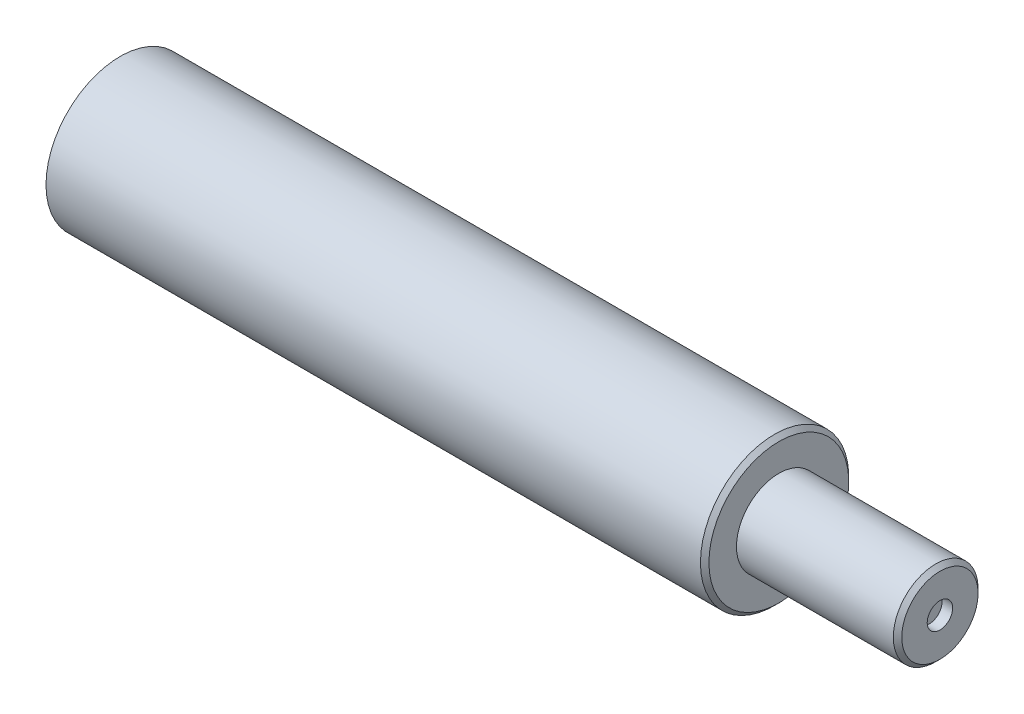
ISO-10303-21;
HEADER;
FILE_DESCRIPTION(('STEP AP214'),'2;1');
FILE_NAME('part.step','',(''),(''),'','','');
FILE_SCHEMA(('AUTOMOTIVE_DESIGN { 1 0 10303 214 1 1 1 1 }'));
ENDSEC;
DATA;
#1=APPLICATION_CONTEXT('core data for automotive mechanical design processes');
#2=APPLICATION_PROTOCOL_DEFINITION('international standard','automotive_design',2000,#1);
#3=PRODUCT_CONTEXT('',#1,'mechanical');
#4=PRODUCT('Part','Part','',(#3));
#5=PRODUCT_RELATED_PRODUCT_CATEGORY('part','',(#4));
#6=PRODUCT_DEFINITION_FORMATION('','',#4);
#7=PRODUCT_DEFINITION_CONTEXT('part definition',#1,'design');
#8=PRODUCT_DEFINITION('design','',#6,#7);
#9=PRODUCT_DEFINITION_SHAPE('','',#8);
#10=(LENGTH_UNIT() NAMED_UNIT(*) SI_UNIT(.MILLI.,.METRE.));
#11=(NAMED_UNIT(*) PLANE_ANGLE_UNIT() SI_UNIT($,.RADIAN.));
#12=(NAMED_UNIT(*) SI_UNIT($,.STERADIAN.) SOLID_ANGLE_UNIT());
#13=UNCERTAINTY_MEASURE_WITH_UNIT(LENGTH_MEASURE(1.E-05),#10,'distance_accuracy_value','');
#14=(GEOMETRIC_REPRESENTATION_CONTEXT(3) GLOBAL_UNCERTAINTY_ASSIGNED_CONTEXT((#13)) GLOBAL_UNIT_ASSIGNED_CONTEXT((#10,
#11,#12)) REPRESENTATION_CONTEXT('',''));
#15=CARTESIAN_POINT('',(0.,0.,0.));
#16=DIRECTION('',(0.,0.,1.));
#17=DIRECTION('',(1.,0.,0.));
#18=AXIS2_PLACEMENT_3D('',#15,#16,#17);
#19=CARTESIAN_POINT('',(0.,17.5,0.));
#20=DIRECTION('',(1.,0.,0.));
#21=DIRECTION('',(0.,0.,-1.));
#22=AXIS2_PLACEMENT_3D('',#19,#20,#21);
#23=PLANE('',#22);
#24=CARTESIAN_POINT('',(0.,-7.,-7.));
#25=DIRECTION('',(-1.,0.,0.));
#26=DIRECTION('',(0.,0.,-1.));
#27=AXIS2_PLACEMENT_3D('',#24,#25,#26);
#28=CIRCLE('',#27,2.5);
#29=CARTESIAN_POINT('',(0.,-7.,-9.5));
#30=VERTEX_POINT('',#29);
#31=EDGE_CURVE('E99',#30,#30,#28,.T.);
#32=ORIENTED_EDGE('',*,*,#31,.F.);
#33=EDGE_LOOP('',(#32));
#34=FACE_BOUND('',#33,.T.);
#35=CARTESIAN_POINT('',(0.,-7.,7.));
#36=DIRECTION('',(-1.,0.,0.));
#37=DIRECTION('',(0.,0.,1.));
#38=AXIS2_PLACEMENT_3D('',#35,#36,#37);
#39=CIRCLE('',#38,2.5);
#40=CARTESIAN_POINT('',(0.,-7.,9.5));
#41=VERTEX_POINT('',#40);
#42=EDGE_CURVE('E107',#41,#41,#39,.T.);
#43=ORIENTED_EDGE('',*,*,#42,.F.);
#44=EDGE_LOOP('',(#43));
#45=FACE_BOUND('',#44,.T.);
#46=CARTESIAN_POINT('',(0.,7.,7.));
#47=DIRECTION('',(-1.,0.,0.));
#48=DIRECTION('',(0.,0.,-1.));
#49=AXIS2_PLACEMENT_3D('',#46,#47,#48);
#50=CIRCLE('',#49,2.5);
#51=CARTESIAN_POINT('',(0.,7.,4.5));
#52=VERTEX_POINT('',#51);
#53=EDGE_CURVE('E115',#52,#52,#50,.T.);
#54=ORIENTED_EDGE('',*,*,#53,.F.);
#55=EDGE_LOOP('',(#54));
#56=FACE_BOUND('',#55,.T.);
#57=CARTESIAN_POINT('',(0.,7.,-7.));
#58=DIRECTION('',(-1.,0.,0.));
#59=DIRECTION('',(0.,0.,1.));
#60=AXIS2_PLACEMENT_3D('',#57,#58,#59);
#61=CIRCLE('',#60,2.5);
#62=CARTESIAN_POINT('',(0.,7.,-4.5));
#63=VERTEX_POINT('',#62);
#64=EDGE_CURVE('E91',#63,#63,#61,.T.);
#65=ORIENTED_EDGE('',*,*,#64,.F.);
#66=EDGE_LOOP('',(#65));
#67=FACE_BOUND('',#66,.T.);
#68=CARTESIAN_POINT('',(0.,0.,0.));
#69=DIRECTION('',(-1.,0.,0.));
#70=DIRECTION('',(0.,0.,1.));
#71=AXIS2_PLACEMENT_3D('',#68,#69,#70);
#72=CIRCLE('',#71,17.5);
#73=CARTESIAN_POINT('',(0.,0.,17.5));
#74=VERTEX_POINT('',#73);
#75=EDGE_CURVE('E74',#74,#74,#72,.T.);
#76=ORIENTED_EDGE('',*,*,#75,.T.);
#77=EDGE_LOOP('',(#76));
#78=FACE_BOUND('',#77,.T.);
#79=ADVANCED_FACE('F49',(#34,#45,#56,#67,#78),#23,.F.);
#80=CARTESIAN_POINT('',(0.,0.,0.));
#81=DIRECTION('',(-1.,0.,0.));
#82=DIRECTION('',(0.,0.,1.));
#83=AXIS2_PLACEMENT_3D('',#80,#81,#82);
#84=CYLINDRICAL_SURFACE('',#83,17.5);
#85=CARTESIAN_POINT('',(154.4,0.,0.));
#86=DIRECTION('',(-1.,0.,0.));
#87=DIRECTION('',(0.,0.,1.));
#88=AXIS2_PLACEMENT_3D('',#85,#86,#87);
#89=CIRCLE('',#88,17.5);
#90=CARTESIAN_POINT('',(154.4,0.,17.5));
#91=VERTEX_POINT('',#90);
#92=EDGE_CURVE('E58',#91,#91,#89,.T.);
#93=ORIENTED_EDGE('',*,*,#92,.T.);
#94=EDGE_LOOP('',(#93));
#95=FACE_BOUND('',#94,.T.);
#96=ORIENTED_EDGE('',*,*,#75,.F.);
#97=EDGE_LOOP('',(#96));
#98=FACE_BOUND('',#97,.T.);
#99=ADVANCED_FACE('F134',(#95,#98),#84,.T.);
#100=CARTESIAN_POINT('',(155.4,17.5,0.));
#101=DIRECTION('',(-1.,0.,0.));
#102=DIRECTION('',(0.,0.,1.));
#103=AXIS2_PLACEMENT_3D('',#100,#101,#102);
#104=PLANE('',#103);
#105=CARTESIAN_POINT('',(155.4,0.,0.));
#106=DIRECTION('',(-1.,0.,0.));
#107=DIRECTION('',(0.,0.,1.));
#108=AXIS2_PLACEMENT_3D('',#105,#106,#107);
#109=CIRCLE('',#108,16.4999999999999);
#110=CARTESIAN_POINT('',(155.4,0.,16.4999999999999));
#111=VERTEX_POINT('',#110);
#112=EDGE_CURVE('E10',#111,#111,#109,.F.);
#113=ORIENTED_EDGE('',*,*,#112,.T.);
#114=EDGE_LOOP('',(#113));
#115=FACE_BOUND('',#114,.T.);
#116=CARTESIAN_POINT('',(155.4,0.,0.));
#117=DIRECTION('',(-1.,0.,0.));
#118=DIRECTION('',(0.,0.,1.));
#119=AXIS2_PLACEMENT_3D('',#116,#117,#118);
#120=CIRCLE('',#119,10.);
#121=CARTESIAN_POINT('',(155.4,0.,10.));
#122=VERTEX_POINT('',#121);
#123=EDGE_CURVE('E78',#122,#122,#120,.T.);
#124=ORIENTED_EDGE('',*,*,#123,.T.);
#125=EDGE_LOOP('',(#124));
#126=FACE_BOUND('',#125,.T.);
#127=ADVANCED_FACE('F142',(#115,#126),#104,.F.);
#128=CARTESIAN_POINT('',(0.,0.,0.));
#129=DIRECTION('',(-1.,0.,0.));
#130=DIRECTION('',(0.,0.,1.));
#131=AXIS2_PLACEMENT_3D('',#128,#129,#130);
#132=CYLINDRICAL_SURFACE('',#131,10.);
#133=CARTESIAN_POINT('',(192.4,0.,0.));
#134=DIRECTION('',(-1.,0.,0.));
#135=DIRECTION('',(0.,0.,1.));
#136=AXIS2_PLACEMENT_3D('',#133,#134,#135);
#137=CIRCLE('',#136,10.);
#138=CARTESIAN_POINT('',(192.4,0.,10.));
#139=VERTEX_POINT('',#138);
#140=EDGE_CURVE('E68',#139,#139,#137,.T.);
#141=ORIENTED_EDGE('',*,*,#140,.T.);
#142=EDGE_LOOP('',(#141));
#143=FACE_BOUND('',#142,.T.);
#144=ORIENTED_EDGE('',*,*,#123,.F.);
#145=EDGE_LOOP('',(#144));
#146=FACE_BOUND('',#145,.T.);
#147=ADVANCED_FACE('F147',(#143,#146),#132,.T.);
#148=CARTESIAN_POINT('',(193.4,10.,0.));
#149=DIRECTION('',(-1.,0.,0.));
#150=DIRECTION('',(0.,0.,1.));
#151=AXIS2_PLACEMENT_3D('',#148,#149,#150);
#152=PLANE('',#151);
#153=CARTESIAN_POINT('',(193.4,0.,0.));
#154=DIRECTION('',(-1.,0.,0.));
#155=DIRECTION('',(0.,0.,1.));
#156=AXIS2_PLACEMENT_3D('',#153,#154,#155);
#157=CIRCLE('',#156,9.00000000000004);
#158=CARTESIAN_POINT('',(193.4,0.,9.00000000000004));
#159=VERTEX_POINT('',#158);
#160=EDGE_CURVE('E63',#159,#159,#157,.F.);
#161=ORIENTED_EDGE('',*,*,#160,.T.);
#162=EDGE_LOOP('',(#161));
#163=FACE_BOUND('',#162,.T.);
#164=CARTESIAN_POINT('',(193.4,0.,0.));
#165=DIRECTION('',(-1.,0.,0.));
#166=DIRECTION('',(0.,0.,1.));
#167=AXIS2_PLACEMENT_3D('',#164,#165,#166);
#168=CIRCLE('',#167,3.);
#169=CARTESIAN_POINT('',(193.4,0.,3.));
#170=VERTEX_POINT('',#169);
#171=EDGE_CURVE('E82',#170,#170,#168,.T.);
#172=ORIENTED_EDGE('',*,*,#171,.T.);
#173=EDGE_LOOP('',(#172));
#174=FACE_BOUND('',#173,.T.);
#175=ADVANCED_FACE('F172',(#163,#174),#152,.F.);
#176=CARTESIAN_POINT('',(0.,0.,0.));
#177=DIRECTION('',(-1.,0.,0.));
#178=DIRECTION('',(0.,0.,1.));
#179=AXIS2_PLACEMENT_3D('',#176,#177,#178);
#180=CYLINDRICAL_SURFACE('',#179,3.);
#181=ORIENTED_EDGE('',*,*,#171,.F.);
#182=EDGE_LOOP('',(#181));
#183=FACE_BOUND('',#182,.T.);
#184=CARTESIAN_POINT('',(190.9,0.,0.));
#185=DIRECTION('',(-1.,0.,0.));
#186=DIRECTION('',(0.,0.,1.));
#187=AXIS2_PLACEMENT_3D('',#184,#185,#186);
#188=CIRCLE('',#187,3.);
#189=CARTESIAN_POINT('',(190.9,0.,3.));
#190=VERTEX_POINT('',#189);
#191=EDGE_CURVE('E86',#190,#190,#188,.T.);
#192=ORIENTED_EDGE('',*,*,#191,.T.);
#193=EDGE_LOOP('',(#192));
#194=FACE_BOUND('',#193,.T.);
#195=ADVANCED_FACE('F163',(#183,#194),#180,.F.);
#196=CARTESIAN_POINT('',(190.9,0.,0.));
#197=DIRECTION('',(-1.,0.,0.));
#198=DIRECTION('',(0.,0.,1.));
#199=AXIS2_PLACEMENT_3D('',#196,#197,#198);
#200=PLANE('',#199);
#201=ORIENTED_EDGE('',*,*,#191,.F.);
#202=EDGE_LOOP('',(#201));
#203=FACE_BOUND('',#202,.T.);
#204=ADVANCED_FACE('F155',(#203),#200,.F.);
#205=CARTESIAN_POINT('',(192.4,0.,0.));
#206=DIRECTION('',(-1.,0.,0.));
#207=DIRECTION('',(0.,0.,1.));
#208=AXIS2_PLACEMENT_3D('',#205,#206,#207);
#209=CONICAL_SURFACE('',#208,10.,0.785398163397444);
#210=ORIENTED_EDGE('',*,*,#160,.F.);
#211=EDGE_LOOP('',(#210));
#212=FACE_BOUND('',#211,.T.);
#213=ORIENTED_EDGE('',*,*,#140,.F.);
#214=EDGE_LOOP('',(#213));
#215=FACE_BOUND('',#214,.T.);
#216=ADVANCED_FACE('F151',(#212,#215),#209,.T.);
#217=CARTESIAN_POINT('',(154.4,0.,0.));
#218=DIRECTION('',(-1.,0.,0.));
#219=DIRECTION('',(0.,0.,1.));
#220=AXIS2_PLACEMENT_3D('',#217,#218,#219);
#221=CONICAL_SURFACE('',#220,17.5,0.785398163397448);
#222=ORIENTED_EDGE('',*,*,#112,.F.);
#223=EDGE_LOOP('',(#222));
#224=FACE_BOUND('',#223,.T.);
#225=ORIENTED_EDGE('',*,*,#92,.F.);
#226=EDGE_LOOP('',(#225));
#227=FACE_BOUND('',#226,.T.);
#228=ADVANCED_FACE('F52',(#224,#227),#221,.T.);
#229=CARTESIAN_POINT('',(27.,7.,-7.));
#230=DIRECTION('',(-1.,0.,0.));
#231=DIRECTION('',(0.,0.,1.));
#232=AXIS2_PLACEMENT_3D('',#229,#230,#231);
#233=CYLINDRICAL_SURFACE('',#232,2.5);
#234=CARTESIAN_POINT('',(27.,7.,-7.));
#235=DIRECTION('',(-1.,0.,0.));
#236=DIRECTION('',(0.,0.,1.));
#237=AXIS2_PLACEMENT_3D('',#234,#235,#236);
#238=CIRCLE('',#237,2.5);
#239=CARTESIAN_POINT('',(27.,7.,-4.5));
#240=VERTEX_POINT('',#239);
#241=EDGE_CURVE('E90',#240,#240,#238,.T.);
#242=ORIENTED_EDGE('',*,*,#241,.F.);
#243=EDGE_LOOP('',(#242));
#244=FACE_BOUND('',#243,.T.);
#245=ORIENTED_EDGE('',*,*,#64,.T.);
#246=EDGE_LOOP('',(#245));
#247=FACE_BOUND('',#246,.T.);
#248=ADVANCED_FACE('F161',(#244,#247),#233,.F.);
#249=CARTESIAN_POINT('',(27.,7.,-7.));
#250=DIRECTION('',(-1.,0.,0.));
#251=DIRECTION('',(0.,0.,1.));
#252=AXIS2_PLACEMENT_3D('',#249,#250,#251);
#253=PLANE('',#252);
#254=ORIENTED_EDGE('',*,*,#241,.T.);
#255=EDGE_LOOP('',(#254));
#256=FACE_BOUND('',#255,.T.);
#257=ADVANCED_FACE('F128',(#256),#253,.T.);
#258=CARTESIAN_POINT('',(27.,7.,7.));
#259=DIRECTION('',(-1.,0.,0.));
#260=DIRECTION('',(0.,0.,1.));
#261=AXIS2_PLACEMENT_3D('',#258,#259,#260);
#262=CYLINDRICAL_SURFACE('',#261,2.5);
#263=CARTESIAN_POINT('',(27.,7.,7.));
#264=DIRECTION('',(-1.,0.,0.));
#265=DIRECTION('',(0.,0.,-1.));
#266=AXIS2_PLACEMENT_3D('',#263,#264,#265);
#267=CIRCLE('',#266,2.5);
#268=CARTESIAN_POINT('',(27.,7.,4.5));
#269=VERTEX_POINT('',#268);
#270=EDGE_CURVE('E95',#269,#269,#267,.T.);
#271=ORIENTED_EDGE('',*,*,#270,.F.);
#272=EDGE_LOOP('',(#271));
#273=FACE_BOUND('',#272,.T.);
#274=ORIENTED_EDGE('',*,*,#53,.T.);
#275=EDGE_LOOP('',(#274));
#276=FACE_BOUND('',#275,.T.);
#277=ADVANCED_FACE('F125',(#273,#276),#262,.F.);
#278=CARTESIAN_POINT('',(27.,7.,7.));
#279=DIRECTION('',(1.,0.,0.));
#280=DIRECTION('',(0.,0.,-1.));
#281=AXIS2_PLACEMENT_3D('',#278,#279,#280);
#282=PLANE('',#281);
#283=ORIENTED_EDGE('',*,*,#270,.T.);
#284=EDGE_LOOP('',(#283));
#285=FACE_BOUND('',#284,.T.);
#286=ADVANCED_FACE('F123',(#285),#282,.F.);
#287=CARTESIAN_POINT('',(27.,-7.,7.));
#288=DIRECTION('',(-1.,0.,0.));
#289=DIRECTION('',(0.,0.,1.));
#290=AXIS2_PLACEMENT_3D('',#287,#288,#289);
#291=CYLINDRICAL_SURFACE('',#290,2.5);
#292=CARTESIAN_POINT('',(27.,-7.,7.));
#293=DIRECTION('',(-1.,0.,0.));
#294=DIRECTION('',(0.,0.,1.));
#295=AXIS2_PLACEMENT_3D('',#292,#293,#294);
#296=CIRCLE('',#295,2.5);
#297=CARTESIAN_POINT('',(27.,-7.,9.5));
#298=VERTEX_POINT('',#297);
#299=EDGE_CURVE('E111',#298,#298,#296,.T.);
#300=ORIENTED_EDGE('',*,*,#299,.F.);
#301=EDGE_LOOP('',(#300));
#302=FACE_BOUND('',#301,.T.);
#303=ORIENTED_EDGE('',*,*,#42,.T.);
#304=EDGE_LOOP('',(#303));
#305=FACE_BOUND('',#304,.T.);
#306=ADVANCED_FACE('F199',(#302,#305),#291,.F.);
#307=CARTESIAN_POINT('',(27.,-7.,7.));
#308=DIRECTION('',(-1.,0.,0.));
#309=DIRECTION('',(0.,0.,1.));
#310=AXIS2_PLACEMENT_3D('',#307,#308,#309);
#311=PLANE('',#310);
#312=ORIENTED_EDGE('',*,*,#299,.T.);
#313=EDGE_LOOP('',(#312));
#314=FACE_BOUND('',#313,.T.);
#315=ADVANCED_FACE('F194',(#314),#311,.T.);
#316=CARTESIAN_POINT('',(27.,-7.,-7.));
#317=DIRECTION('',(-1.,0.,0.));
#318=DIRECTION('',(0.,0.,1.));
#319=AXIS2_PLACEMENT_3D('',#316,#317,#318);
#320=CYLINDRICAL_SURFACE('',#319,2.5);
#321=CARTESIAN_POINT('',(27.,-7.,-7.));
#322=DIRECTION('',(-1.,0.,0.));
#323=DIRECTION('',(0.,0.,-1.));
#324=AXIS2_PLACEMENT_3D('',#321,#322,#323);
#325=CIRCLE('',#324,2.5);
#326=CARTESIAN_POINT('',(27.,-7.,-9.5));
#327=VERTEX_POINT('',#326);
#328=EDGE_CURVE('E103',#327,#327,#325,.T.);
#329=ORIENTED_EDGE('',*,*,#328,.F.);
#330=EDGE_LOOP('',(#329));
#331=FACE_BOUND('',#330,.T.);
#332=ORIENTED_EDGE('',*,*,#31,.T.);
#333=EDGE_LOOP('',(#332));
#334=FACE_BOUND('',#333,.T.);
#335=ADVANCED_FACE('F190',(#331,#334),#320,.F.);
#336=CARTESIAN_POINT('',(27.,-7.,-7.));
#337=DIRECTION('',(1.,0.,0.));
#338=DIRECTION('',(0.,0.,-1.));
#339=AXIS2_PLACEMENT_3D('',#336,#337,#338);
#340=PLANE('',#339);
#341=ORIENTED_EDGE('',*,*,#328,.T.);
#342=EDGE_LOOP('',(#341));
#343=FACE_BOUND('',#342,.T.);
#344=ADVANCED_FACE('F193',(#343),#340,.F.);
#345=CLOSED_SHELL('',(#79,#99,#127,#147,#175,#195,#204,#216,#228,#248,#257,#277,#286,#306,#315,
#335,#344));
#346=MANIFOLD_SOLID_BREP('B2',#345);
#347=ADVANCED_BREP_SHAPE_REPRESENTATION('',(#18,#346),#14);
#348=SHAPE_DEFINITION_REPRESENTATION(#9,#347);
ENDSEC;
END-ISO-10303-21;
